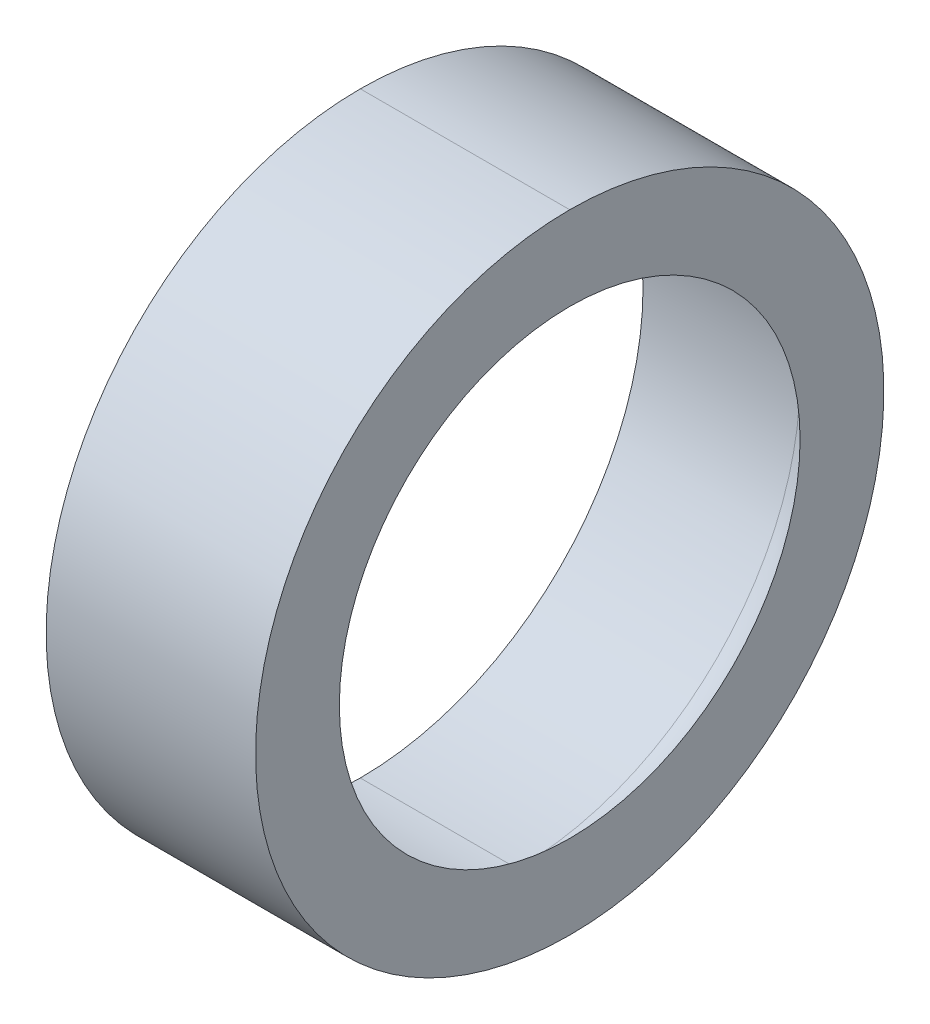
ISO-10303-21;
HEADER;
FILE_DESCRIPTION(('STEP AP214'),'2;1');
FILE_NAME('part.step','',(''),(''),'','','');
FILE_SCHEMA(('AUTOMOTIVE_DESIGN { 1 0 10303 214 1 1 1 1 }'));
ENDSEC;
DATA;
#1=APPLICATION_CONTEXT('core data for automotive mechanical design processes');
#2=APPLICATION_PROTOCOL_DEFINITION('international standard','automotive_design',2000,#1);
#3=PRODUCT_CONTEXT('',#1,'mechanical');
#4=PRODUCT('Part','Part','',(#3));
#5=PRODUCT_RELATED_PRODUCT_CATEGORY('part','',(#4));
#6=PRODUCT_DEFINITION_FORMATION('','',#4);
#7=PRODUCT_DEFINITION_CONTEXT('part definition',#1,'design');
#8=PRODUCT_DEFINITION('design','',#6,#7);
#9=PRODUCT_DEFINITION_SHAPE('','',#8);
#10=(LENGTH_UNIT() NAMED_UNIT(*) SI_UNIT(.MILLI.,.METRE.));
#11=(NAMED_UNIT(*) PLANE_ANGLE_UNIT() SI_UNIT($,.RADIAN.));
#12=(NAMED_UNIT(*) SI_UNIT($,.STERADIAN.) SOLID_ANGLE_UNIT());
#13=UNCERTAINTY_MEASURE_WITH_UNIT(LENGTH_MEASURE(1.E-05),#10,'distance_accuracy_value','');
#14=(GEOMETRIC_REPRESENTATION_CONTEXT(3) GLOBAL_UNCERTAINTY_ASSIGNED_CONTEXT((#13)) GLOBAL_UNIT_ASSIGNED_CONTEXT((#10,
#11,#12)) REPRESENTATION_CONTEXT('',''));
#15=CARTESIAN_POINT('',(0.,0.,0.));
#16=DIRECTION('',(0.,0.,1.));
#17=DIRECTION('',(1.,0.,0.));
#18=AXIS2_PLACEMENT_3D('',#15,#16,#17);
#19=CARTESIAN_POINT('',(20.25,12.25,-20.25));
#20=DIRECTION('',(-1.,0.,0.));
#21=DIRECTION('',(0.,0.,1.));
#22=AXIS2_PLACEMENT_3D('',#19,#20,#21);
#23=PLANE('',#22);
#24=CARTESIAN_POINT('',(20.25,14.,-18.25));
#25=DIRECTION('',(1.,0.,0.));
#26=DIRECTION('',(0.,1.,0.));
#27=AXIS2_PLACEMENT_3D('',#24,#25,#26);
#28=CIRCLE('',#27,1.5);
#29=CARTESIAN_POINT('',(20.25,15.5,-18.25));
#30=VERTEX_POINT('',#29);
#31=CARTESIAN_POINT('',(20.25,12.5,-18.25));
#32=VERTEX_POINT('',#31);
#33=EDGE_CURVE('E54',#30,#32,#28,.T.);
#34=ORIENTED_EDGE('',*,*,#33,.T.);
#35=CARTESIAN_POINT('',(20.25,14.,-18.25));
#36=DIRECTION('',(1.,0.,0.));
#37=DIRECTION('',(0.,1.,0.));
#38=AXIS2_PLACEMENT_3D('',#35,#36,#37);
#39=CIRCLE('',#38,1.5);
#40=EDGE_CURVE('E113',#32,#30,#39,.T.);
#41=ORIENTED_EDGE('',*,*,#40,.T.);
#42=EDGE_LOOP('',(#34,#41));
#43=FACE_BOUND('',#42,.T.);
#44=CARTESIAN_POINT('',(20.25,14.,-18.25));
#45=DIRECTION('',(1.,0.,0.));
#46=DIRECTION('',(0.,1.,0.));
#47=AXIS2_PLACEMENT_3D('',#44,#45,#46);
#48=CIRCLE('',#47,1.1);
#49=CARTESIAN_POINT('',(20.25,15.1,-18.25));
#50=VERTEX_POINT('',#49);
#51=CARTESIAN_POINT('',(20.25,12.9,-18.25));
#52=VERTEX_POINT('',#51);
#53=EDGE_CURVE('E183',#50,#52,#48,.T.);
#54=ORIENTED_EDGE('',*,*,#53,.F.);
#55=CARTESIAN_POINT('',(20.25,14.,-18.25));
#56=DIRECTION('',(1.,0.,0.));
#57=DIRECTION('',(0.,1.,0.));
#58=AXIS2_PLACEMENT_3D('',#55,#56,#57);
#59=CIRCLE('',#58,1.1);
#60=EDGE_CURVE('E127',#52,#50,#59,.T.);
#61=ORIENTED_EDGE('',*,*,#60,.F.);
#62=EDGE_LOOP('',(#54,#61));
#63=FACE_BOUND('',#62,.T.);
#64=ADVANCED_FACE('F51',(#43,#63),#23,.F.);
#65=CARTESIAN_POINT('',(19.25,14.,-18.25));
#66=DIRECTION('',(1.,0.,0.));
#67=DIRECTION('',(0.,1.,0.));
#68=AXIS2_PLACEMENT_3D('',#65,#66,#67);
#69=CYLINDRICAL_SURFACE('',#68,1.5);
#70=DIRECTION('',(1.,0.,0.));
#71=VECTOR('',#70,1.);
#72=CARTESIAN_POINT('',(19.25,12.5,-18.25));
#73=LINE('',#72,#71);
#74=CARTESIAN_POINT('',(19.25,12.5,-18.25));
#75=VERTEX_POINT('',#74);
#76=EDGE_CURVE('E123',#75,#32,#73,.T.);
#77=ORIENTED_EDGE('',*,*,#76,.T.);
#78=ORIENTED_EDGE('',*,*,#33,.F.);
#79=DIRECTION('',(1.,0.,0.));
#80=VECTOR('',#79,1.);
#81=CARTESIAN_POINT('',(19.25,15.5,-18.25));
#82=LINE('',#81,#80);
#83=CARTESIAN_POINT('',(19.25,15.5,-18.25));
#84=VERTEX_POINT('',#83);
#85=EDGE_CURVE('E121',#84,#30,#82,.T.);
#86=ORIENTED_EDGE('',*,*,#85,.F.);
#87=CARTESIAN_POINT('',(19.25,14.,-18.25));
#88=DIRECTION('',(1.,0.,0.));
#89=DIRECTION('',(0.,1.,0.));
#90=AXIS2_PLACEMENT_3D('',#87,#88,#89);
#91=CIRCLE('',#90,1.5);
#92=EDGE_CURVE('E72',#84,#75,#91,.T.);
#93=ORIENTED_EDGE('',*,*,#92,.T.);
#94=EDGE_LOOP('',(#77,#78,#86,#93));
#95=FACE_BOUND('',#94,.T.);
#96=ADVANCED_FACE('F120',(#95),#69,.T.);
#97=CARTESIAN_POINT('',(19.25,14.,-18.25));
#98=DIRECTION('',(1.,0.,0.));
#99=DIRECTION('',(0.,1.,0.));
#100=AXIS2_PLACEMENT_3D('',#97,#98,#99);
#101=PLANE('',#100);
#102=CARTESIAN_POINT('',(19.25,14.,-18.25));
#103=DIRECTION('',(1.,0.,0.));
#104=DIRECTION('',(0.,1.,0.));
#105=AXIS2_PLACEMENT_3D('',#102,#103,#104);
#106=CIRCLE('',#105,1.35);
#107=CARTESIAN_POINT('',(19.25,12.65,-18.25));
#108=VERTEX_POINT('',#107);
#109=CARTESIAN_POINT('',(19.25,15.35,-18.25));
#110=VERTEX_POINT('',#109);
#111=EDGE_CURVE('E60',#108,#110,#106,.T.);
#112=ORIENTED_EDGE('',*,*,#111,.T.);
#113=CARTESIAN_POINT('',(19.25,14.,-18.25));
#114=DIRECTION('',(1.,0.,0.));
#115=DIRECTION('',(0.,1.,0.));
#116=AXIS2_PLACEMENT_3D('',#113,#114,#115);
#117=CIRCLE('',#116,1.35);
#118=EDGE_CURVE('E162',#110,#108,#117,.T.);
#119=ORIENTED_EDGE('',*,*,#118,.T.);
#120=EDGE_LOOP('',(#112,#119));
#121=FACE_BOUND('',#120,.T.);
#122=ORIENTED_EDGE('',*,*,#92,.F.);
#123=CARTESIAN_POINT('',(19.25,14.,-18.25));
#124=DIRECTION('',(1.,0.,0.));
#125=DIRECTION('',(0.,1.,0.));
#126=AXIS2_PLACEMENT_3D('',#123,#124,#125);
#127=CIRCLE('',#126,1.5);
#128=EDGE_CURVE('E125',#75,#84,#127,.T.);
#129=ORIENTED_EDGE('',*,*,#128,.F.);
#130=EDGE_LOOP('',(#122,#129));
#131=FACE_BOUND('',#130,.T.);
#132=ADVANCED_FACE('F245',(#121,#131),#101,.F.);
#133=CARTESIAN_POINT('',(19.25,14.,-18.25));
#134=DIRECTION('',(1.,0.,0.));
#135=DIRECTION('',(0.,1.,0.));
#136=AXIS2_PLACEMENT_3D('',#133,#134,#135);
#137=CYLINDRICAL_SURFACE('',#136,1.5);
#138=ORIENTED_EDGE('',*,*,#128,.T.);
#139=ORIENTED_EDGE('',*,*,#85,.T.);
#140=ORIENTED_EDGE('',*,*,#40,.F.);
#141=ORIENTED_EDGE('',*,*,#76,.F.);
#142=EDGE_LOOP('',(#138,#139,#140,#141));
#143=FACE_BOUND('',#142,.T.);
#144=ADVANCED_FACE('F124',(#143),#137,.T.);
#145=CARTESIAN_POINT('',(20.25,14.,-18.25));
#146=DIRECTION('',(-1.,0.,0.));
#147=DIRECTION('',(0.,-1.,0.));
#148=AXIS2_PLACEMENT_3D('',#145,#146,#147);
#149=CYLINDRICAL_SURFACE('',#148,1.35);
#150=DIRECTION('',(-1.,0.,0.));
#151=VECTOR('',#150,1.);
#152=CARTESIAN_POINT('',(20.25,15.35,-18.25));
#153=LINE('',#152,#151);
#154=CARTESIAN_POINT('',(20.,15.35,-18.25));
#155=VERTEX_POINT('',#154);
#156=EDGE_CURVE('E169',#155,#110,#153,.T.);
#157=ORIENTED_EDGE('',*,*,#156,.T.);
#158=ORIENTED_EDGE('',*,*,#111,.F.);
#159=DIRECTION('',(-1.,0.,0.));
#160=VECTOR('',#159,1.);
#161=CARTESIAN_POINT('',(20.25,12.65,-18.25));
#162=LINE('',#161,#160);
#163=CARTESIAN_POINT('',(20.,12.65,-18.25));
#164=VERTEX_POINT('',#163);
#165=EDGE_CURVE('E156',#164,#108,#162,.T.);
#166=ORIENTED_EDGE('',*,*,#165,.F.);
#167=CARTESIAN_POINT('',(20.,14.,-18.25));
#168=DIRECTION('',(-1.,0.,0.));
#169=DIRECTION('',(0.,1.,0.));
#170=AXIS2_PLACEMENT_3D('',#167,#168,#169);
#171=CIRCLE('',#170,1.35);
#172=EDGE_CURVE('E11',#155,#164,#171,.T.);
#173=ORIENTED_EDGE('',*,*,#172,.F.);
#174=EDGE_LOOP('',(#157,#158,#166,#173));
#175=FACE_BOUND('',#174,.T.);
#176=ADVANCED_FACE('F258',(#175),#149,.F.);
#177=CARTESIAN_POINT('',(20.,14.,-18.25));
#178=DIRECTION('',(1.,0.,0.));
#179=DIRECTION('',(0.,1.,0.));
#180=AXIS2_PLACEMENT_3D('',#177,#178,#179);
#181=TOROIDAL_SURFACE('',#180,1.1,0.25);
#182=CARTESIAN_POINT('',(20.,12.9,-18.25));
#183=DIRECTION('',(0.,0.,1.));
#184=DIRECTION('',(0.,1.,0.));
#185=AXIS2_PLACEMENT_3D('',#182,#183,#184);
#186=CIRCLE('',#185,0.25);
#187=EDGE_CURVE('E190',#164,#52,#186,.T.);
#188=ORIENTED_EDGE('',*,*,#187,.T.);
#189=ORIENTED_EDGE('',*,*,#60,.T.);
#190=CARTESIAN_POINT('',(20.,15.1,-18.25));
#191=DIRECTION('',(0.,0.,-1.));
#192=DIRECTION('',(0.,-1.,0.));
#193=AXIS2_PLACEMENT_3D('',#190,#191,#192);
#194=CIRCLE('',#193,0.25);
#195=EDGE_CURVE('E176',#155,#50,#194,.T.);
#196=ORIENTED_EDGE('',*,*,#195,.F.);
#197=ORIENTED_EDGE('',*,*,#172,.T.);
#198=EDGE_LOOP('',(#188,#189,#196,#197));
#199=FACE_BOUND('',#198,.T.);
#200=ADVANCED_FACE('F239',(#199),#181,.F.);
#201=CARTESIAN_POINT('',(20.25,14.,-18.25));
#202=DIRECTION('',(-1.,0.,0.));
#203=DIRECTION('',(0.,-1.,0.));
#204=AXIS2_PLACEMENT_3D('',#201,#202,#203);
#205=CYLINDRICAL_SURFACE('',#204,1.35);
#206=CARTESIAN_POINT('',(20.,14.,-18.25));
#207=DIRECTION('',(-1.,0.,0.));
#208=DIRECTION('',(0.,1.,0.));
#209=AXIS2_PLACEMENT_3D('',#206,#207,#208);
#210=CIRCLE('',#209,1.35);
#211=EDGE_CURVE('E119',#164,#155,#210,.T.);
#212=ORIENTED_EDGE('',*,*,#211,.F.);
#213=ORIENTED_EDGE('',*,*,#165,.T.);
#214=ORIENTED_EDGE('',*,*,#118,.F.);
#215=ORIENTED_EDGE('',*,*,#156,.F.);
#216=EDGE_LOOP('',(#212,#213,#214,#215));
#217=FACE_BOUND('',#216,.T.);
#218=ADVANCED_FACE('F234',(#217),#205,.F.);
#219=CARTESIAN_POINT('',(20.,14.,-18.25));
#220=DIRECTION('',(1.,0.,0.));
#221=DIRECTION('',(0.,1.,0.));
#222=AXIS2_PLACEMENT_3D('',#219,#220,#221);
#223=TOROIDAL_SURFACE('',#222,1.1,0.25);
#224=ORIENTED_EDGE('',*,*,#211,.T.);
#225=ORIENTED_EDGE('',*,*,#195,.T.);
#226=ORIENTED_EDGE('',*,*,#53,.T.);
#227=ORIENTED_EDGE('',*,*,#187,.F.);
#228=EDGE_LOOP('',(#224,#225,#226,#227));
#229=FACE_BOUND('',#228,.T.);
#230=ADVANCED_FACE('F230',(#229),#223,.F.);
#231=CLOSED_SHELL('',(#64,#96,#132,#144,#176,#200,#218,#230));
#232=MANIFOLD_SOLID_BREP('B2',#231);
#233=ADVANCED_BREP_SHAPE_REPRESENTATION('',(#18,#232),#14);
#234=SHAPE_DEFINITION_REPRESENTATION(#9,#233);
ENDSEC;
END-ISO-10303-21;
